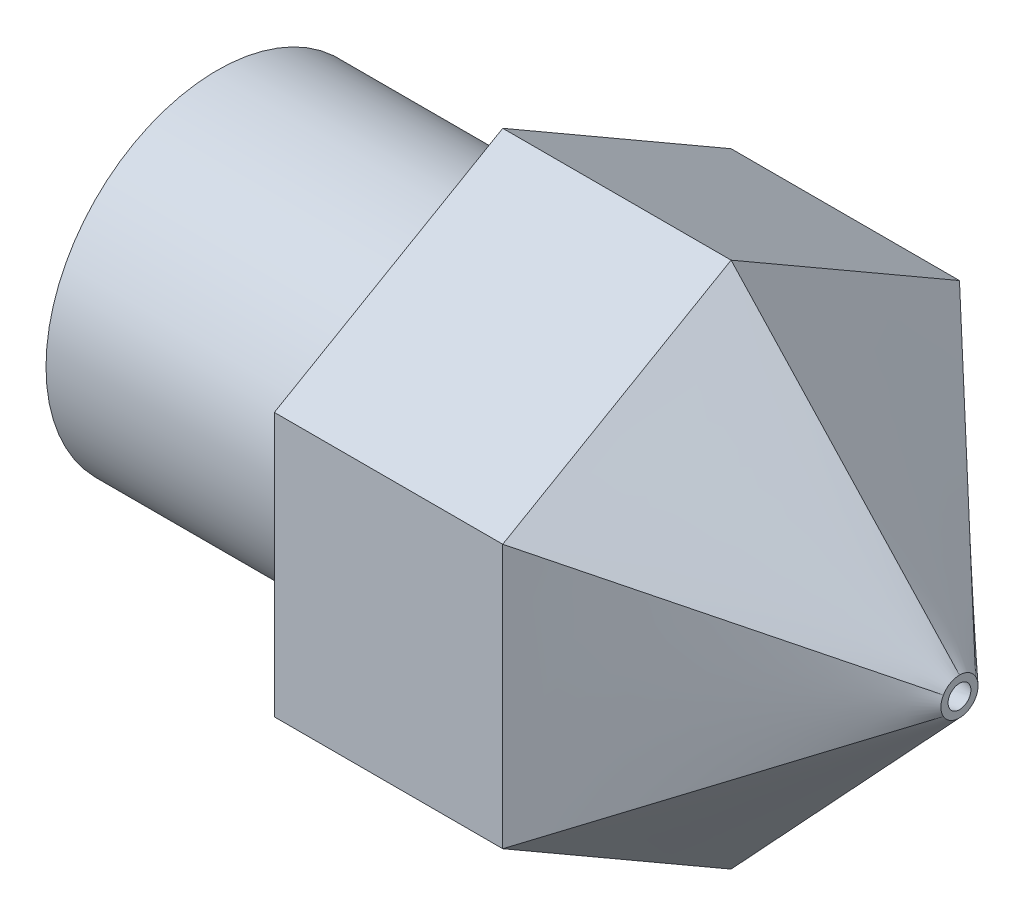
ISO-10303-21;
HEADER;
FILE_DESCRIPTION(('STEP AP214'),'2;1');
FILE_NAME('part.step','',(''),(''),'','','');
FILE_SCHEMA(('AUTOMOTIVE_DESIGN { 1 0 10303 214 1 1 1 1 }'));
ENDSEC;
DATA;
#1=APPLICATION_CONTEXT('core data for automotive mechanical design processes');
#2=APPLICATION_PROTOCOL_DEFINITION('international standard','automotive_design',2000,#1);
#3=PRODUCT_CONTEXT('',#1,'mechanical');
#4=PRODUCT('Part','Part','',(#3));
#5=PRODUCT_RELATED_PRODUCT_CATEGORY('part','',(#4));
#6=PRODUCT_DEFINITION_FORMATION('','',#4);
#7=PRODUCT_DEFINITION_CONTEXT('part definition',#1,'design');
#8=PRODUCT_DEFINITION('design','',#6,#7);
#9=PRODUCT_DEFINITION_SHAPE('','',#8);
#10=(LENGTH_UNIT() NAMED_UNIT(*) SI_UNIT(.MILLI.,.METRE.));
#11=(NAMED_UNIT(*) PLANE_ANGLE_UNIT() SI_UNIT($,.RADIAN.));
#12=(NAMED_UNIT(*) SI_UNIT($,.STERADIAN.) SOLID_ANGLE_UNIT());
#13=UNCERTAINTY_MEASURE_WITH_UNIT(LENGTH_MEASURE(1.E-05),#10,'distance_accuracy_value','');
#14=(GEOMETRIC_REPRESENTATION_CONTEXT(3) GLOBAL_UNCERTAINTY_ASSIGNED_CONTEXT((#13)) GLOBAL_UNIT_ASSIGNED_CONTEXT((#10,
#11,#12)) REPRESENTATION_CONTEXT('',''));
#15=CARTESIAN_POINT('',(0.,0.,0.));
#16=DIRECTION('',(0.,0.,1.));
#17=DIRECTION('',(1.,0.,0.));
#18=AXIS2_PLACEMENT_3D('',#15,#16,#17);
#19=CARTESIAN_POINT('',(4.,0.,0.));
#20=DIRECTION('',(1.,0.,0.));
#21=DIRECTION('',(0.,0.,-1.));
#22=AXIS2_PLACEMENT_3D('',#19,#20,#21);
#23=PLANE('',#22);
#24=CARTESIAN_POINT('',(4.,0.,0.));
#25=DIRECTION('',(1.,0.,0.));
#26=DIRECTION('',(0.,0.,-1.));
#27=AXIS2_PLACEMENT_3D('',#24,#25,#26);
#28=CIRCLE('',#27,0.2);
#29=CARTESIAN_POINT('',(4.,0.0957996605289521,0.175563165392224));
#30=VERTEX_POINT('',#29);
#31=EDGE_CURVE('E199',#30,#30,#28,.T.);
#32=ORIENTED_EDGE('',*,*,#31,.F.);
#33=EDGE_LOOP('',(#32));
#34=FACE_BOUND('',#33,.T.);
#35=CARTESIAN_POINT('',(4.,0.,0.));
#36=DIRECTION('',(1.,0.,0.));
#37=DIRECTION('',(0.,0.,-1.));
#38=AXIS2_PLACEMENT_3D('',#35,#36,#37);
#39=CIRCLE('',#38,0.325);
#40=CARTESIAN_POINT('',(4.,-0.325,0.));
#41=VERTEX_POINT('',#40);
#42=CARTESIAN_POINT('',(4.,-0.162499999999998,-0.281458256229944));
#43=VERTEX_POINT('',#42);
#44=EDGE_CURVE('E12',#41,#43,#39,.T.);
#45=ORIENTED_EDGE('',*,*,#44,.T.);
#46=CARTESIAN_POINT('',(4.,0.162500000000003,-0.281458256229941));
#47=VERTEX_POINT('',#46);
#48=EDGE_CURVE('E96',#43,#47,#39,.T.);
#49=ORIENTED_EDGE('',*,*,#48,.T.);
#50=CARTESIAN_POINT('',(4.,0.325,0.));
#51=VERTEX_POINT('',#50);
#52=EDGE_CURVE('E496',#47,#51,#39,.T.);
#53=ORIENTED_EDGE('',*,*,#52,.T.);
#54=CARTESIAN_POINT('',(4.,0.162499999999999,0.281458256229943));
#55=VERTEX_POINT('',#54);
#56=EDGE_CURVE('E500',#51,#55,#39,.T.);
#57=ORIENTED_EDGE('',*,*,#56,.T.);
#58=CARTESIAN_POINT('',(4.,-0.162500000000002,0.281458256229942));
#59=VERTEX_POINT('',#58);
#60=EDGE_CURVE('E378',#55,#59,#39,.T.);
#61=ORIENTED_EDGE('',*,*,#60,.T.);
#62=EDGE_CURVE('E364',#59,#41,#39,.T.);
#63=ORIENTED_EDGE('',*,*,#62,.T.);
#64=EDGE_LOOP('',(#45,#49,#53,#57,#61,#63));
#65=FACE_BOUND('',#64,.T.);
#66=ADVANCED_FACE('F85',(#34,#65),#23,.T.);
#67=CARTESIAN_POINT('',(0.,4.618802153517,0.));
#68=CARTESIAN_POINT('',(4.,0.325,0.));
#69=CARTESIAN_POINT('',(0.,4.23390197405725,0.666666666666668));
#70=CARTESIAN_POINT('',(4.,0.325,0.0541666666666672));
#71=CARTESIAN_POINT('',(0.,3.8490017945975,1.33333333333334));
#72=CARTESIAN_POINT('',(4.,0.310486085409981,0.112222325026744));
#73=CARTESIAN_POINT('',(0.,3.07920143567799,2.66666666666667));
#74=CARTESIAN_POINT('',(4.,0.252430427049904,0.212777674973258));
#75=CARTESIAN_POINT('',(0.,2.69430125621824,3.33333333333333));
#76=CARTESIAN_POINT('',(4.,0.209409709371656,0.25437492289661));
#77=CARTESIAN_POINT('',(0.,2.30940107675849,4.));
#78=CARTESIAN_POINT('',(4.,0.162499999999999,0.281458256229943));
#79=B_SPLINE_SURFACE_WITH_KNOTS('',3,1,((#67,#68),(#69,#70),(#71,#72),(#73,#74),(#75,#76),(#77,
#78)),.UNSPECIFIED.,.F.,.F.,.F.,(4,2,4),(2,2),(0.,0.5,1.),(0.,1.),.UNSPECIFIED.);
#80=DIRECTION('',(0.,-0.500000000000001,0.866025403784438));
#81=VECTOR('',#80,1.);
#82=CARTESIAN_POINT('',(0.,4.618802153517,0.));
#83=LINE('',#82,#81);
#84=CARTESIAN_POINT('',(0.,4.618802153517,0.));
#85=VERTEX_POINT('',#84);
#86=CARTESIAN_POINT('',(0.,2.30940107675849,4.));
#87=VERTEX_POINT('',#86);
#88=EDGE_CURVE('E190',#85,#87,#83,.T.);
#89=DIRECTION('',(0.681630468376725,-0.365848296627346,-0.633667837621097));
#90=VECTOR('',#89,1.);
#91=CARTESIAN_POINT('',(2.,1.23595053837924,2.14072912811497));
#92=LINE('',#91,#90);
#93=EDGE_CURVE('E390',#87,#55,#92,.T.);
#94=DIRECTION('',(-0.681630468376725,0.731696593254695,0.));
#95=VECTOR('',#94,1.);
#96=CARTESIAN_POINT('',(2.,2.4719010767585,0.));
#97=LINE('',#96,#95);
#98=EDGE_CURVE('E396',#51,#85,#97,.T.);
#99=ORIENTED_EDGE('',*,*,#88,.T.);
#100=ORIENTED_EDGE('',*,*,#93,.T.);
#101=ORIENTED_EDGE('',*,*,#56,.F.);
#102=ORIENTED_EDGE('',*,*,#98,.T.);
#103=EDGE_LOOP('',(#99,#100,#101,#102));
#104=FACE_BOUND('',#103,.T.);
#105=ADVANCED_FACE('F264',(#104),#79,.T.);
#106=CARTESIAN_POINT('',(0.,2.30940107675849,4.));
#107=CARTESIAN_POINT('',(4.,0.162499999999999,0.281458256229943));
#108=CARTESIAN_POINT('',(0.,1.53960071783899,4.));
#109=CARTESIAN_POINT('',(4.,0.115590290628341,0.308541589563276));
#110=CARTESIAN_POINT('',(0.,0.769800358919486,3.99999999999999));
#111=CARTESIAN_POINT('',(4.,0.058055658360075,0.325));
#112=CARTESIAN_POINT('',(0.,-0.769800358919517,3.99999999999999));
#113=CARTESIAN_POINT('',(4.,-0.0580556583600783,0.325));
#114=CARTESIAN_POINT('',(0.,-1.53960071783902,3.99999999999999));
#115=CARTESIAN_POINT('',(4.,-0.115590290628345,0.308541589563275));
#116=CARTESIAN_POINT('',(0.,-2.30940107675852,3.99999999999998));
#117=CARTESIAN_POINT('',(4.,-0.162500000000002,0.281458256229942));
#118=B_SPLINE_SURFACE_WITH_KNOTS('',3,1,((#106,#107),(#108,#109),(#110,#111),(#112,#113),(#114,
#115),(#116,#117)),.UNSPECIFIED.,.F.,.F.,.F.,(4,2,4),(2,2),(0.,0.5,1.),(0.,1.),.UNSPECIFIED.);
#119=DIRECTION('',(0.,-1.,0.));
#120=VECTOR('',#119,1.);
#121=CARTESIAN_POINT('',(0.,2.30940107675849,4.));
#122=LINE('',#121,#120);
#123=CARTESIAN_POINT('',(0.,-2.30940107675852,3.99999999999998));
#124=VERTEX_POINT('',#123);
#125=EDGE_CURVE('E387',#87,#124,#122,.T.);
#126=DIRECTION('',(0.681630468376725,0.365848296627351,-0.633667837621094));
#127=VECTOR('',#126,1.);
#128=CARTESIAN_POINT('',(2.,-1.23595053837926,2.14072912811496));
#129=LINE('',#128,#127);
#130=EDGE_CURVE('E374',#124,#59,#129,.T.);
#131=ORIENTED_EDGE('',*,*,#125,.T.);
#132=ORIENTED_EDGE('',*,*,#130,.T.);
#133=ORIENTED_EDGE('',*,*,#60,.F.);
#134=ORIENTED_EDGE('',*,*,#93,.F.);
#135=EDGE_LOOP('',(#131,#132,#133,#134));
#136=FACE_BOUND('',#135,.T.);
#137=ADVANCED_FACE('F275',(#136),#118,.T.);
#138=CARTESIAN_POINT('',(0.,2.30940107675855,-3.99999999999997));
#139=CARTESIAN_POINT('',(4.,0.162500000000003,-0.281458256229941));
#140=CARTESIAN_POINT('',(0.,2.69430125621829,-3.3333333333333));
#141=CARTESIAN_POINT('',(4.,0.209409709371659,-0.254374922896607));
#142=CARTESIAN_POINT('',(0.,3.07920143567803,-2.66666666666664));
#143=CARTESIAN_POINT('',(4.,0.252430427049906,-0.212777674973255));
#144=CARTESIAN_POINT('',(0.,3.84900179459752,-1.33333333333332));
#145=CARTESIAN_POINT('',(4.,0.310486085409981,-0.112222325026742));
#146=CARTESIAN_POINT('',(0.,4.23390197405726,-0.666666666666659));
#147=CARTESIAN_POINT('',(4.,0.325,-0.0541666666666659));
#148=CARTESIAN_POINT('',(0.,4.618802153517,0.));
#149=CARTESIAN_POINT('',(4.,0.325,0.));
#150=B_SPLINE_SURFACE_WITH_KNOTS('',3,1,((#138,#139),(#140,#141),(#142,#143),(#144,#145),(#146,
#147),(#148,#149)),.UNSPECIFIED.,.F.,.F.,.F.,(4,2,4),(2,2),(0.,0.5,1.),(0.,1.),.UNSPECIFIED.);
#151=DIRECTION('',(0.,0.499999999999995,0.866025403784442));
#152=VECTOR('',#151,1.);
#153=CARTESIAN_POINT('',(0.,2.30940107675855,-3.99999999999997));
#154=LINE('',#153,#152);
#155=CARTESIAN_POINT('',(0.,2.30940107675855,-3.99999999999997));
#156=VERTEX_POINT('',#155);
#157=EDGE_CURVE('E89',#156,#85,#154,.T.);
#158=DIRECTION('',(0.681630468376725,-0.365848296627355,0.633667837621091));
#159=VECTOR('',#158,1.);
#160=CARTESIAN_POINT('',(2.,1.23595053837927,-2.14072912811495));
#161=LINE('',#160,#159);
#162=EDGE_CURVE('E379',#156,#47,#161,.T.);
#163=ORIENTED_EDGE('',*,*,#157,.T.);
#164=ORIENTED_EDGE('',*,*,#98,.F.);
#165=ORIENTED_EDGE('',*,*,#52,.F.);
#166=ORIENTED_EDGE('',*,*,#162,.F.);
#167=EDGE_LOOP('',(#163,#164,#165,#166));
#168=FACE_BOUND('',#167,.T.);
#169=ADVANCED_FACE('F449',(#168),#150,.T.);
#170=CARTESIAN_POINT('',(0.,-2.30940107675852,3.99999999999998));
#171=CARTESIAN_POINT('',(4.,-0.162500000000002,0.281458256229942));
#172=CARTESIAN_POINT('',(0.,-2.69430125621827,3.33333333333331));
#173=CARTESIAN_POINT('',(4.,-0.209409709371659,0.254374922896608));
#174=CARTESIAN_POINT('',(0.,-3.07920143567801,2.66666666666664));
#175=CARTESIAN_POINT('',(4.,-0.252430427049906,0.212777674973255));
#176=CARTESIAN_POINT('',(0.,-3.84900179459751,1.33333333333331));
#177=CARTESIAN_POINT('',(4.,-0.310486085409981,0.112222325026742));
#178=CARTESIAN_POINT('',(0.,-4.23390197405725,0.666666666666637));
#179=CARTESIAN_POINT('',(4.,-0.325,0.0541666666666649));
#180=CARTESIAN_POINT('',(0.,-4.618802153517,0.));
#181=CARTESIAN_POINT('',(4.,-0.325,0.));
#182=B_SPLINE_SURFACE_WITH_KNOTS('',3,1,((#170,#171),(#172,#173),(#174,#175),(#176,#177),(#178,
#179),(#180,#181)),.UNSPECIFIED.,.F.,.F.,.F.,(4,2,4),(2,2),(0.,0.5,1.),(0.,1.),.UNSPECIFIED.);
#183=DIRECTION('',(0.,-0.499999999999995,-0.866025403784441));
#184=VECTOR('',#183,1.);
#185=CARTESIAN_POINT('',(0.,-2.30940107675852,3.99999999999998));
#186=LINE('',#185,#184);
#187=CARTESIAN_POINT('',(0.,-4.618802153517,0.));
#188=VERTEX_POINT('',#187);
#189=EDGE_CURVE('E404',#124,#188,#186,.T.);
#190=DIRECTION('',(0.681630468376725,0.731696593254695,0.));
#191=VECTOR('',#190,1.);
#192=CARTESIAN_POINT('',(2.,-2.4719010767585,0.));
#193=LINE('',#192,#191);
#194=EDGE_CURVE('E375',#188,#41,#193,.T.);
#195=ORIENTED_EDGE('',*,*,#189,.T.);
#196=ORIENTED_EDGE('',*,*,#194,.T.);
#197=ORIENTED_EDGE('',*,*,#62,.F.);
#198=ORIENTED_EDGE('',*,*,#130,.F.);
#199=EDGE_LOOP('',(#195,#196,#197,#198));
#200=FACE_BOUND('',#199,.T.);
#201=ADVANCED_FACE('F324',(#200),#182,.T.);
#202=CARTESIAN_POINT('',(0.,-4.618802153517,0.));
#203=CARTESIAN_POINT('',(4.,-0.325,0.));
#204=CARTESIAN_POINT('',(0.,-4.23390197405724,-0.666666666666694));
#205=CARTESIAN_POINT('',(4.,-0.325,-0.0541666666666684));
#206=CARTESIAN_POINT('',(0.,-3.84900179459749,-1.33333333333336));
#207=CARTESIAN_POINT('',(4.,-0.31048608540998,-0.112222325026745));
#208=CARTESIAN_POINT('',(0.,-3.07920143567798,-2.66666666666669));
#209=CARTESIAN_POINT('',(4.,-0.252430427049903,-0.212777674973258));
#210=CARTESIAN_POINT('',(0.,-2.69430125621822,-3.33333333333335));
#211=CARTESIAN_POINT('',(4.,-0.209409709371656,-0.254374922896611));
#212=CARTESIAN_POINT('',(0.,-2.30940107675846,-4.00000000000002));
#213=CARTESIAN_POINT('',(4.,-0.162499999999998,-0.281458256229944));
#214=B_SPLINE_SURFACE_WITH_KNOTS('',3,1,((#202,#203),(#204,#205),(#206,#207),(#208,#209),(#210,
#211),(#212,#213)),.UNSPECIFIED.,.F.,.F.,.F.,(4,2,4),(2,2),(0.,0.5,1.),(0.,1.),.UNSPECIFIED.);
#215=DIRECTION('',(0.,0.500000000000007,-0.866025403784434));
#216=VECTOR('',#215,1.);
#217=CARTESIAN_POINT('',(0.,-4.618802153517,0.));
#218=LINE('',#217,#216);
#219=CARTESIAN_POINT('',(0.,-2.30940107675846,-4.00000000000002));
#220=VERTEX_POINT('',#219);
#221=EDGE_CURVE('E419',#188,#220,#218,.T.);
#222=DIRECTION('',(0.681630468376725,0.365848296627342,0.633667837621099));
#223=VECTOR('',#222,1.);
#224=CARTESIAN_POINT('',(2.,-1.23595053837923,-2.14072912811498));
#225=LINE('',#224,#223);
#226=EDGE_CURVE('E394',#220,#43,#225,.T.);
#227=ORIENTED_EDGE('',*,*,#221,.T.);
#228=ORIENTED_EDGE('',*,*,#226,.T.);
#229=ORIENTED_EDGE('',*,*,#44,.F.);
#230=ORIENTED_EDGE('',*,*,#194,.F.);
#231=EDGE_LOOP('',(#227,#228,#229,#230));
#232=FACE_BOUND('',#231,.T.);
#233=ADVANCED_FACE('F313',(#232),#214,.T.);
#234=CARTESIAN_POINT('',(0.,-2.30940107675846,-4.00000000000002));
#235=CARTESIAN_POINT('',(4.,-0.162499999999998,-0.281458256229944));
#236=CARTESIAN_POINT('',(0.,-1.53960071783896,-4.00000000000001));
#237=CARTESIAN_POINT('',(4.,-0.115590290628341,-0.308541589563277));
#238=CARTESIAN_POINT('',(0.,-0.769800358919456,-4.));
#239=CARTESIAN_POINT('',(4.,-0.0580556583600741,-0.325));
#240=CARTESIAN_POINT('',(0.,0.769800358919547,-3.99999999999998));
#241=CARTESIAN_POINT('',(4.,0.0580556583600795,-0.324999999999999));
#242=CARTESIAN_POINT('',(0.,1.53960071783905,-3.99999999999998));
#243=CARTESIAN_POINT('',(4.,0.115590290628346,-0.308541589563275));
#244=CARTESIAN_POINT('',(0.,2.30940107675855,-3.99999999999997));
#245=CARTESIAN_POINT('',(4.,0.162500000000003,-0.281458256229941));
#246=B_SPLINE_SURFACE_WITH_KNOTS('',3,1,((#234,#235),(#236,#237),(#238,#239),(#240,#241),(#242,
#243),(#244,#245)),.UNSPECIFIED.,.F.,.F.,.F.,(4,2,4),(2,2),(0.,0.5,1.),(0.,1.),.UNSPECIFIED.);
#247=DIRECTION('',(0.,1.,0.));
#248=VECTOR('',#247,1.);
#249=CARTESIAN_POINT('',(0.,-2.30940107675846,-4.00000000000002));
#250=LINE('',#249,#248);
#251=EDGE_CURVE('E426',#220,#156,#250,.T.);
#252=ORIENTED_EDGE('',*,*,#251,.T.);
#253=ORIENTED_EDGE('',*,*,#162,.T.);
#254=ORIENTED_EDGE('',*,*,#48,.F.);
#255=ORIENTED_EDGE('',*,*,#226,.F.);
#256=EDGE_LOOP('',(#252,#253,#254,#255));
#257=FACE_BOUND('',#256,.T.);
#258=ADVANCED_FACE('F262',(#257),#246,.T.);
#259=CARTESIAN_POINT('',(4.,0.0957996605289521,0.175563165392224));
#260=CARTESIAN_POINT('',(1.5,0.907220297780593,0.420655834732971));
#261=CARTESIAN_POINT('',(4.,0.446925991313401,-0.0160361556656797));
#262=CARTESIAN_POINT('',(1.5,1.74853196724653,-1.39378476082822));
#263=CARTESIAN_POINT('',(4.,0.255326670255497,-0.367162486450129));
#264=CARTESIAN_POINT('',(1.5,-0.065908628314652,-2.23509643029416));
#265=CARTESIAN_POINT('',(4.,-0.0957996605289521,-0.175563165392224));
#266=CARTESIAN_POINT('',(1.5,-0.907220297780593,-0.420655834732971));
#267=CARTESIAN_POINT('',(4.,-0.446925991313401,0.0160361556656799));
#268=CARTESIAN_POINT('',(1.5,-1.74853196724654,1.39378476082822));
#269=CARTESIAN_POINT('',(4.,-0.255326670255497,0.367162486450129));
#270=CARTESIAN_POINT('',(1.5,0.065908628314653,2.23509643029416));
#271=CARTESIAN_POINT('',(4.,0.0957996605289521,0.175563165392224));
#272=CARTESIAN_POINT('',(1.5,0.907220297780593,0.420655834732971));
#273=(BOUNDED_SURFACE() B_SPLINE_SURFACE(3,1,((#259,#260),(#261,#262),(#263,#264),(#265,#266),
(#267,#268),(#269,#270),(#271,#272)),.UNSPECIFIED.,.T.,.F.,.F.) B_SPLINE_SURFACE_WITH_KNOTS((4,
3,4),(2,2),(0.,0.5,1.),(0.,1.),
.UNSPECIFIED.) GEOMETRIC_REPRESENTATION_ITEM() RATIONAL_B_SPLINE_SURFACE(((1.,1.),
(0.333333333333333,0.333333333333333),(0.333333333333333,0.333333333333333),(1.,1.),
(0.333333333333333,0.333333333333333),(0.333333333333333,0.333333333333333),(1.,1.))) REPRESENTATION_ITEM('') SURFACE());
#274=CARTESIAN_POINT('',(1.5,0.,0.));
#275=DIRECTION('',(1.,0.,0.));
#276=DIRECTION('',(0.,0.,-1.));
#277=AXIS2_PLACEMENT_3D('',#274,#275,#276);
#278=CIRCLE('',#277,1.);
#279=CARTESIAN_POINT('',(1.5,0.907220297780593,0.420655834732971));
#280=VERTEX_POINT('',#279);
#281=EDGE_CURVE('E194',#280,#280,#278,.T.);
#282=CARTESIAN_POINT('',(4.,0.0957996605289521,0.175563165392224));
#283=CARTESIAN_POINT('',(3.97395833333333,0.104251958833657,0.178116214031191));
#284=CARTESIAN_POINT('',(3.94791666666667,0.112704257138361,0.180669262670157));
#285=CARTESIAN_POINT('',(3.89583333333333,0.12960885374777,0.185775359948089));
#286=CARTESIAN_POINT('',(3.86979166666667,0.138061152052475,0.188328408587055));
#287=CARTESIAN_POINT('',(3.81770833333333,0.154965748661884,0.193434505864987));
#288=CARTESIAN_POINT('',(3.79166666666667,0.163418046966589,0.195987554503953));
#289=CARTESIAN_POINT('',(3.73958333333333,0.180322643575998,0.201093651781885));
#290=CARTESIAN_POINT('',(3.71354166666667,0.188774941880703,0.203646700420852));
#291=CARTESIAN_POINT('',(3.66145833333333,0.205679538490112,0.208752797698784));
#292=CARTESIAN_POINT('',(3.63541666666667,0.214131836794816,0.21130584633775));
#293=CARTESIAN_POINT('',(3.58333333333333,0.231036433404226,0.216411943615682));
#294=CARTESIAN_POINT('',(3.55729166666667,0.23948873170893,0.218964992254648));
#295=CARTESIAN_POINT('',(3.50520833333333,0.256393328318339,0.22407108953258));
#296=CARTESIAN_POINT('',(3.47916666666667,0.264845626623044,0.226624138171547));
#297=CARTESIAN_POINT('',(3.42708333333333,0.281750223232453,0.231730235449479));
#298=CARTESIAN_POINT('',(3.40104166666667,0.290202521537158,0.234283284088445));
#299=CARTESIAN_POINT('',(3.34895833333333,0.307107118146567,0.239389381366377));
#300=CARTESIAN_POINT('',(3.32291666666667,0.315559416451271,0.241942430005343));
#301=CARTESIAN_POINT('',(3.27083333333333,0.332464013060681,0.247048527283275));
#302=CARTESIAN_POINT('',(3.24479166666667,0.340916311365385,0.249601575922241));
#303=CARTESIAN_POINT('',(3.19270833333333,0.357820907974794,0.254707673200174));
#304=CARTESIAN_POINT('',(3.16666666666667,0.366273206279499,0.25726072183914));
#305=CARTESIAN_POINT('',(3.11458333333333,0.383177802888908,0.262366819117072));
#306=CARTESIAN_POINT('',(3.08854166666667,0.391630101193613,0.264919867756038));
#307=CARTESIAN_POINT('',(3.03645833333333,0.408534697803022,0.27002596503397));
#308=CARTESIAN_POINT('',(3.01041666666667,0.416986996107727,0.272579013672936));
#309=CARTESIAN_POINT('',(2.95833333333333,0.433891592717136,0.277685110950869));
#310=CARTESIAN_POINT('',(2.93229166666667,0.44234389102184,0.280238159589835));
#311=CARTESIAN_POINT('',(2.88020833333333,0.45924848763125,0.285344256867767));
#312=CARTESIAN_POINT('',(2.85416666666667,0.467700785935954,0.287897305506733));
#313=CARTESIAN_POINT('',(2.80208333333333,0.484605382545363,0.293003402784665));
#314=CARTESIAN_POINT('',(2.77604166666667,0.493057680850068,0.295556451423631));
#315=CARTESIAN_POINT('',(2.72395833333333,0.509962277459477,0.300662548701564));
#316=CARTESIAN_POINT('',(2.69791666666667,0.518414575764182,0.30321559734053));
#317=CARTESIAN_POINT('',(2.64583333333333,0.535319172373591,0.308321694618462));
#318=CARTESIAN_POINT('',(2.61979166666667,0.543771470678295,0.310874743257428));
#319=CARTESIAN_POINT('',(2.56770833333333,0.560676067287705,0.31598084053536));
#320=CARTESIAN_POINT('',(2.54166666666667,0.569128365592409,0.318533889174326));
#321=CARTESIAN_POINT('',(2.48958333333333,0.586032962201819,0.323639986452259));
#322=CARTESIAN_POINT('',(2.46354166666667,0.594485260506523,0.326193035091225));
#323=CARTESIAN_POINT('',(2.41145833333333,0.611389857115932,0.331299132369157));
#324=CARTESIAN_POINT('',(2.38541666666667,0.619842155420637,0.333852181008123));
#325=CARTESIAN_POINT('',(2.33333333333333,0.636746752030046,0.338958278286055));
#326=CARTESIAN_POINT('',(2.30729166666667,0.645199050334751,0.341511326925021));
#327=CARTESIAN_POINT('',(2.25520833333333,0.66210364694416,0.346617424202954));
#328=CARTESIAN_POINT('',(2.22916666666667,0.670555945248864,0.34917047284192));
#329=CARTESIAN_POINT('',(2.17708333333333,0.687460541858274,0.354276570119852));
#330=CARTESIAN_POINT('',(2.15104166666667,0.695912840162978,0.356829618758818));
#331=CARTESIAN_POINT('',(2.09895833333333,0.712817436772387,0.36193571603675));
#332=CARTESIAN_POINT('',(2.07291666666667,0.721269735077092,0.364488764675716));
#333=CARTESIAN_POINT('',(2.02083333333333,0.738174331686501,0.369594861953648));
#334=CARTESIAN_POINT('',(1.99479166666667,0.746626629991206,0.372147910592615));
#335=CARTESIAN_POINT('',(1.94270833333333,0.763531226600615,0.377254007870547));
#336=CARTESIAN_POINT('',(1.91666666666667,0.77198352490532,0.379807056509513));
#337=CARTESIAN_POINT('',(1.86458333333333,0.788888121514729,0.384913153787445));
#338=CARTESIAN_POINT('',(1.83854166666667,0.797340419819433,0.387466202426411));
#339=CARTESIAN_POINT('',(1.78645833333333,0.814245016428843,0.392572299704343));
#340=CARTESIAN_POINT('',(1.76041666666667,0.822697314733547,0.39512534834331));
#341=CARTESIAN_POINT('',(1.70833333333333,0.839601911342956,0.400231445621242));
#342=CARTESIAN_POINT('',(1.68229166666667,0.848054209647661,0.402784494260208));
#343=CARTESIAN_POINT('',(1.63020833333333,0.86495880625707,0.40789059153814));
#344=CARTESIAN_POINT('',(1.60416666666667,0.873411104561775,0.410443640177106));
#345=CARTESIAN_POINT('',(1.55208333333333,0.890315701171184,0.415549737455038));
#346=CARTESIAN_POINT('',(1.52604166666667,0.898767999475888,0.418102786094005));
#347=CARTESIAN_POINT('',(1.5,0.907220297780593,0.420655834732971));
#348=B_SPLINE_CURVE_WITH_KNOTS('',3,(#282,#283,#284,#285,#286,#287,#288,#289,#290,#291,#292,
#293,#294,#295,#296,#297,#298,#299,#300,#301,#302,#303,#304,#305,#306,#307,#308,#309,#310,#311,
#312,#313,#314,#315,#316,#317,#318,#319,#320,#321,#322,#323,#324,#325,#326,#327,#328,#329,#330,
#331,#332,#333,#334,#335,#336,#337,#338,#339,#340,#341,#342,#343,#344,#345,#346,#347),
.UNSPECIFIED.,.F.,.F.,(4,2,2,2,2,2,2,2,2,2,2,2,2,2,2,2,2,2,2,2,2,2,2,2,2,2,2,2,2,2,2,2,4),(0.,
0.0824933346450594,0.164986669290119,0.247480003935178,0.329973338580237,0.412466673225297,
0.494960007870356,0.577453342515415,0.659946677160475,0.742440011805534,0.824933346450594,
0.907426681095653,0.989920015740712,1.07241335038577,1.15490668503083,1.23740001967589,
1.31989335432095,1.40238668896601,1.48488002361107,1.56737335825613,1.64986669290119,
1.73236002754625,1.8148533621913,1.89734669683636,1.97984003148142,2.06233336612648,
2.14482670077154,2.2273200354166,2.30981337006166,2.39230670470672,2.47480003935178,
2.55729337399684,2.6397867086419),.UNSPECIFIED.);
#349=EDGE_CURVE('BSEAM251',#30,#280,#348,.T.);
#350=ORIENTED_EDGE('',*,*,#31,.T.);
#351=ORIENTED_EDGE('',*,*,#281,.F.);
#352=ORIENTED_EDGE('',*,*,#349,.T.);
#353=ORIENTED_EDGE('',*,*,#349,.F.);
#354=EDGE_LOOP('',(#350,#352,#351,#353));
#355=FACE_BOUND('',#354,.T.);
#356=ADVANCED_FACE('F251',(#355),#273,.F.);
#357=CARTESIAN_POINT('',(-0.00222715685592239,0.,0.));
#358=DIRECTION('',(1.,0.,0.));
#359=DIRECTION('',(0.,0.,-1.));
#360=AXIS2_PLACEMENT_3D('',#357,#358,#359);
#361=CYLINDRICAL_SURFACE('',#360,1.);
#362=ORIENTED_EDGE('',*,*,#281,.T.);
#363=EDGE_LOOP('',(#362));
#364=FACE_BOUND('',#363,.T.);
#365=CARTESIAN_POINT('',(-9.,0.,0.));
#366=DIRECTION('',(-1.,0.,0.));
#367=DIRECTION('',(0.,0.,1.));
#368=AXIS2_PLACEMENT_3D('',#365,#366,#367);
#369=CIRCLE('',#368,1.);
#370=CARTESIAN_POINT('',(-9.,0.,1.));
#371=VERTEX_POINT('',#370);
#372=EDGE_CURVE('E851',#371,#371,#369,.T.);
#373=ORIENTED_EDGE('',*,*,#372,.T.);
#374=EDGE_LOOP('',(#373));
#375=FACE_BOUND('',#374,.T.);
#376=ADVANCED_FACE('F228',(#364,#375),#361,.F.);
#377=CARTESIAN_POINT('',(-4.,3.46410161513775,2.));
#378=DIRECTION('',(0.,-0.866025403784438,-0.500000000000001));
#379=DIRECTION('',(0.,0.500000000000001,-0.866025403784438));
#380=AXIS2_PLACEMENT_3D('',#377,#378,#379);
#381=PLANE('',#380);
#382=ORIENTED_EDGE('',*,*,#88,.F.);
#383=DIRECTION('',(1.,0.,0.));
#384=VECTOR('',#383,1.);
#385=CARTESIAN_POINT('',(-4.,4.618802153517,0.));
#386=LINE('',#385,#384);
#387=CARTESIAN_POINT('',(-4.,4.618802153517,0.));
#388=VERTEX_POINT('',#387);
#389=EDGE_CURVE('E163',#388,#85,#386,.T.);
#390=ORIENTED_EDGE('',*,*,#389,.F.);
#391=CARTESIAN_POINT('',(-4.,2.30940107675849,4.));
#392=DIRECTION('',(0.,0.500000000000001,-0.866025403784438));
#393=VECTOR('',#392,1.);
#394=LINE('',#391,#393);
#395=CARTESIAN_POINT('',(-4.,2.30940107675849,4.));
#396=VERTEX_POINT('',#395);
#397=EDGE_CURVE('E171',#396,#388,#394,.T.);
#398=ORIENTED_EDGE('',*,*,#397,.F.);
#399=DIRECTION('',(1.,0.,0.));
#400=VECTOR('',#399,1.);
#401=CARTESIAN_POINT('',(-4.,2.30940107675849,4.));
#402=LINE('',#401,#400);
#403=EDGE_CURVE('E772',#396,#87,#402,.T.);
#404=ORIENTED_EDGE('',*,*,#403,.T.);
#405=EDGE_LOOP('',(#382,#390,#398,#404));
#406=FACE_BOUND('',#405,.T.);
#407=ADVANCED_FACE('F188',(#406),#381,.F.);
#408=CARTESIAN_POINT('',(-4.,3.46410161513777,-1.99999999999998));
#409=DIRECTION('',(0.,-0.866025403784442,0.499999999999995));
#410=DIRECTION('',(0.,-0.499999999999995,-0.866025403784442));
#411=AXIS2_PLACEMENT_3D('',#408,#409,#410);
#412=PLANE('',#411);
#413=ORIENTED_EDGE('',*,*,#157,.F.);
#414=DIRECTION('',(1.,0.,0.));
#415=VECTOR('',#414,1.);
#416=CARTESIAN_POINT('',(-4.,2.30940107675855,-3.99999999999997));
#417=LINE('',#416,#415);
#418=CARTESIAN_POINT('',(-4.,2.30940107675855,-3.99999999999997));
#419=VERTEX_POINT('',#418);
#420=EDGE_CURVE('E165',#419,#156,#417,.T.);
#421=ORIENTED_EDGE('',*,*,#420,.F.);
#422=CARTESIAN_POINT('',(-4.,4.618802153517,0.));
#423=DIRECTION('',(0.,-0.499999999999995,-0.866025403784441));
#424=VECTOR('',#423,1.);
#425=LINE('',#422,#424);
#426=EDGE_CURVE('E157',#388,#419,#425,.T.);
#427=ORIENTED_EDGE('',*,*,#426,.F.);
#428=ORIENTED_EDGE('',*,*,#389,.T.);
#429=EDGE_LOOP('',(#413,#421,#427,#428));
#430=FACE_BOUND('',#429,.T.);
#431=ADVANCED_FACE('F161',(#430),#412,.F.);
#432=CARTESIAN_POINT('',(-4.,0.,-3.99999999999999));
#433=DIRECTION('',(0.,0.,1.));
#434=DIRECTION('',(0.,-1.,0.));
#435=AXIS2_PLACEMENT_3D('',#432,#433,#434);
#436=PLANE('',#435);
#437=ORIENTED_EDGE('',*,*,#251,.F.);
#438=DIRECTION('',(1.,0.,0.));
#439=VECTOR('',#438,1.);
#440=CARTESIAN_POINT('',(-4.,-2.30940107675846,-4.00000000000002));
#441=LINE('',#440,#439);
#442=CARTESIAN_POINT('',(-4.,-2.30940107675846,-4.00000000000002));
#443=VERTEX_POINT('',#442);
#444=EDGE_CURVE('E201',#443,#220,#441,.T.);
#445=ORIENTED_EDGE('',*,*,#444,.F.);
#446=CARTESIAN_POINT('',(-4.,2.30940107675855,-3.99999999999997));
#447=DIRECTION('',(0.,-1.,0.));
#448=VECTOR('',#447,1.);
#449=LINE('',#446,#448);
#450=EDGE_CURVE('E170',#419,#443,#449,.T.);
#451=ORIENTED_EDGE('',*,*,#450,.F.);
#452=ORIENTED_EDGE('',*,*,#420,.T.);
#453=EDGE_LOOP('',(#437,#445,#451,#452));
#454=FACE_BOUND('',#453,.T.);
#455=ADVANCED_FACE('F221',(#454),#436,.F.);
#456=CARTESIAN_POINT('',(-4.,-3.46410161513773,-2.00000000000002));
#457=DIRECTION('',(0.,0.866025403784434,0.500000000000007));
#458=DIRECTION('',(0.,-0.500000000000007,0.866025403784435));
#459=AXIS2_PLACEMENT_3D('',#456,#457,#458);
#460=PLANE('',#459);
#461=ORIENTED_EDGE('',*,*,#221,.F.);
#462=DIRECTION('',(1.,0.,0.));
#463=VECTOR('',#462,1.);
#464=CARTESIAN_POINT('',(-4.,-4.618802153517,0.));
#465=LINE('',#464,#463);
#466=CARTESIAN_POINT('',(-4.,-4.618802153517,0.));
#467=VERTEX_POINT('',#466);
#468=EDGE_CURVE('E777',#467,#188,#465,.T.);
#469=ORIENTED_EDGE('',*,*,#468,.F.);
#470=CARTESIAN_POINT('',(-4.,-2.30940107675846,-4.00000000000002));
#471=DIRECTION('',(0.,-0.500000000000007,0.866025403784434));
#472=VECTOR('',#471,1.);
#473=LINE('',#470,#472);
#474=EDGE_CURVE('E766',#443,#467,#473,.T.);
#475=ORIENTED_EDGE('',*,*,#474,.F.);
#476=ORIENTED_EDGE('',*,*,#444,.T.);
#477=EDGE_LOOP('',(#461,#469,#475,#476));
#478=FACE_BOUND('',#477,.T.);
#479=ADVANCED_FACE('F608',(#478),#460,.F.);
#480=CARTESIAN_POINT('',(-4.,-3.46410161513776,1.99999999999998));
#481=DIRECTION('',(0.,0.866025403784441,-0.499999999999995));
#482=DIRECTION('',(0.,0.499999999999995,0.866025403784442));
#483=AXIS2_PLACEMENT_3D('',#480,#481,#482);
#484=PLANE('',#483);
#485=ORIENTED_EDGE('',*,*,#189,.F.);
#486=DIRECTION('',(1.,0.,0.));
#487=VECTOR('',#486,1.);
#488=CARTESIAN_POINT('',(-4.,-2.30940107675852,3.99999999999998));
#489=LINE('',#488,#487);
#490=CARTESIAN_POINT('',(-4.,-2.30940107675852,3.99999999999998));
#491=VERTEX_POINT('',#490);
#492=EDGE_CURVE('E774',#491,#124,#489,.T.);
#493=ORIENTED_EDGE('',*,*,#492,.F.);
#494=CARTESIAN_POINT('',(-4.,-4.618802153517,0.));
#495=DIRECTION('',(0.,0.499999999999995,0.866025403784441));
#496=VECTOR('',#495,1.);
#497=LINE('',#494,#496);
#498=EDGE_CURVE('E768',#467,#491,#497,.T.);
#499=ORIENTED_EDGE('',*,*,#498,.F.);
#500=ORIENTED_EDGE('',*,*,#468,.T.);
#501=EDGE_LOOP('',(#485,#493,#499,#500));
#502=FACE_BOUND('',#501,.T.);
#503=ADVANCED_FACE('F615',(#502),#484,.F.);
#504=CARTESIAN_POINT('',(-4.,0.,3.99999999999999));
#505=DIRECTION('',(0.,0.,-1.));
#506=DIRECTION('',(0.,1.,0.));
#507=AXIS2_PLACEMENT_3D('',#504,#505,#506);
#508=PLANE('',#507);
#509=ORIENTED_EDGE('',*,*,#125,.F.);
#510=ORIENTED_EDGE('',*,*,#403,.F.);
#511=CARTESIAN_POINT('',(-4.,-2.30940107675852,3.99999999999998));
#512=DIRECTION('',(0.,1.,0.));
#513=VECTOR('',#512,1.);
#514=LINE('',#511,#513);
#515=EDGE_CURVE('E178',#491,#396,#514,.T.);
#516=ORIENTED_EDGE('',*,*,#515,.F.);
#517=ORIENTED_EDGE('',*,*,#492,.T.);
#518=EDGE_LOOP('',(#509,#510,#516,#517));
#519=FACE_BOUND('',#518,.T.);
#520=ADVANCED_FACE('F621',(#519),#508,.F.);
#521=CARTESIAN_POINT('',(-4.,0.,0.));
#522=DIRECTION('',(-1.,0.,0.));
#523=DIRECTION('',(0.,0.,1.));
#524=AXIS2_PLACEMENT_3D('',#521,#522,#523);
#525=PLANE('',#524);
#526=CARTESIAN_POINT('',(-4.,0.,0.));
#527=DIRECTION('',(-1.,0.,0.));
#528=DIRECTION('',(0.,0.,1.));
#529=AXIS2_PLACEMENT_3D('',#526,#527,#528);
#530=CIRCLE('',#529,3.);
#531=CARTESIAN_POINT('',(-4.,0.,3.));
#532=VERTEX_POINT('',#531);
#533=EDGE_CURVE('E185',#532,#532,#530,.T.);
#534=ORIENTED_EDGE('',*,*,#533,.F.);
#535=EDGE_LOOP('',(#534));
#536=FACE_BOUND('',#535,.T.);
#537=ORIENTED_EDGE('',*,*,#397,.T.);
#538=ORIENTED_EDGE('',*,*,#426,.T.);
#539=ORIENTED_EDGE('',*,*,#450,.T.);
#540=ORIENTED_EDGE('',*,*,#474,.T.);
#541=ORIENTED_EDGE('',*,*,#498,.T.);
#542=ORIENTED_EDGE('',*,*,#515,.T.);
#543=EDGE_LOOP('',(#537,#538,#539,#540,#541,#542));
#544=FACE_BOUND('',#543,.T.);
#545=ADVANCED_FACE('F176',(#536,#544),#525,.T.);
#546=CARTESIAN_POINT('',(-9.,0.,0.));
#547=DIRECTION('',(1.,0.,0.));
#548=DIRECTION('',(0.,0.,-1.));
#549=AXIS2_PLACEMENT_3D('',#546,#547,#548);
#550=CYLINDRICAL_SURFACE('',#549,3.);
#551=ORIENTED_EDGE('',*,*,#533,.T.);
#552=EDGE_LOOP('',(#551));
#553=FACE_BOUND('',#552,.T.);
#554=CARTESIAN_POINT('',(-9.,0.,0.));
#555=DIRECTION('',(-1.,0.,0.));
#556=DIRECTION('',(0.,0.,1.));
#557=AXIS2_PLACEMENT_3D('',#554,#555,#556);
#558=CIRCLE('',#557,3.);
#559=CARTESIAN_POINT('',(-9.,0.,3.));
#560=VERTEX_POINT('',#559);
#561=EDGE_CURVE('E847',#560,#560,#558,.T.);
#562=ORIENTED_EDGE('',*,*,#561,.F.);
#563=EDGE_LOOP('',(#562));
#564=FACE_BOUND('',#563,.T.);
#565=ADVANCED_FACE('F634',(#553,#564),#550,.T.);
#566=CARTESIAN_POINT('',(-9.,0.,0.));
#567=DIRECTION('',(-1.,0.,0.));
#568=DIRECTION('',(0.,0.,1.));
#569=AXIS2_PLACEMENT_3D('',#566,#567,#568);
#570=PLANE('',#569);
#571=ORIENTED_EDGE('',*,*,#372,.F.);
#572=EDGE_LOOP('',(#571));
#573=FACE_BOUND('',#572,.T.);
#574=ORIENTED_EDGE('',*,*,#561,.T.);
#575=EDGE_LOOP('',(#574));
#576=FACE_BOUND('',#575,.T.);
#577=ADVANCED_FACE('F641',(#573,#576),#570,.T.);
#578=CLOSED_SHELL('',(#66,#105,#137,#169,#201,#233,#258,#356,#376,#407,#431,#455,#479,#503,#520,
#545,#565,#577));
#579=MANIFOLD_SOLID_BREP('B2',#578);
#580=ADVANCED_BREP_SHAPE_REPRESENTATION('',(#18,#579),#14);
#581=SHAPE_DEFINITION_REPRESENTATION(#9,#580);
ENDSEC;
END-ISO-10303-21;
